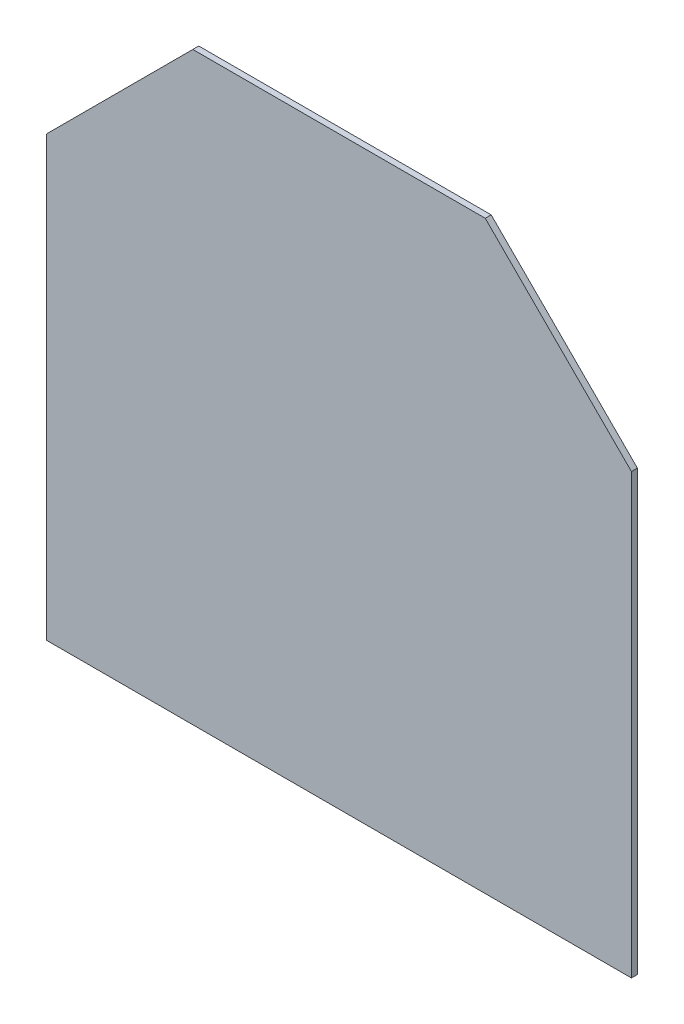
ISO-10303-21;
HEADER;
FILE_DESCRIPTION(('STEP AP214'),'2;1');
FILE_NAME('part.step','',(''),(''),'','','');
FILE_SCHEMA(('AUTOMOTIVE_DESIGN { 1 0 10303 214 1 1 1 1 }'));
ENDSEC;
DATA;
#1=APPLICATION_CONTEXT('core data for automotive mechanical design processes');
#2=APPLICATION_PROTOCOL_DEFINITION('international standard','automotive_design',2000,#1);
#3=PRODUCT_CONTEXT('',#1,'mechanical');
#4=PRODUCT('Part','Part','',(#3));
#5=PRODUCT_RELATED_PRODUCT_CATEGORY('part','',(#4));
#6=PRODUCT_DEFINITION_FORMATION('','',#4);
#7=PRODUCT_DEFINITION_CONTEXT('part definition',#1,'design');
#8=PRODUCT_DEFINITION('design','',#6,#7);
#9=PRODUCT_DEFINITION_SHAPE('','',#8);
#10=(LENGTH_UNIT() NAMED_UNIT(*) SI_UNIT(.MILLI.,.METRE.));
#11=(NAMED_UNIT(*) PLANE_ANGLE_UNIT() SI_UNIT($,.RADIAN.));
#12=(NAMED_UNIT(*) SI_UNIT($,.STERADIAN.) SOLID_ANGLE_UNIT());
#13=UNCERTAINTY_MEASURE_WITH_UNIT(LENGTH_MEASURE(1.E-05),#10,'distance_accuracy_value','');
#14=(GEOMETRIC_REPRESENTATION_CONTEXT(3) GLOBAL_UNCERTAINTY_ASSIGNED_CONTEXT((#13)) GLOBAL_UNIT_ASSIGNED_CONTEXT((#10,
#11,#12)) REPRESENTATION_CONTEXT('',''));
#15=CARTESIAN_POINT('',(0.,0.,0.));
#16=DIRECTION('',(0.,0.,1.));
#17=DIRECTION('',(1.,0.,0.));
#18=AXIS2_PLACEMENT_3D('',#15,#16,#17);
#19=CARTESIAN_POINT('',(4.999408739739,80.,0.45));
#20=DIRECTION('',(0.,-1.,0.));
#21=DIRECTION('',(0.,0.,-1.));
#22=AXIS2_PLACEMENT_3D('',#19,#20,#21);
#23=PLANE('',#22);
#24=DIRECTION('',(1.,0.,0.));
#25=VECTOR('',#24,1.);
#26=CARTESIAN_POINT('',(4.999408739739,80.,1.06));
#27=LINE('',#26,#25);
#28=CARTESIAN_POINT('',(15.0007945402028,80.,1.06));
#29=VERTEX_POINT('',#28);
#30=CARTESIAN_POINT('',(45.0007945402028,80.,1.06));
#31=VERTEX_POINT('',#30);
#32=EDGE_CURVE('E132',#29,#31,#27,.T.);
#33=ORIENTED_EDGE('',*,*,#32,.T.);
#34=DIRECTION('',(0.,0.,1.));
#35=VECTOR('',#34,1.);
#36=CARTESIAN_POINT('',(45.0007945402028,80.,0.45));
#37=LINE('',#36,#35);
#38=CARTESIAN_POINT('',(45.0007945402028,80.,0.45));
#39=VERTEX_POINT('',#38);
#40=EDGE_CURVE('E11',#39,#31,#37,.T.);
#41=ORIENTED_EDGE('',*,*,#40,.F.);
#42=DIRECTION('',(1.,0.,0.));
#43=VECTOR('',#42,1.);
#44=CARTESIAN_POINT('',(4.999408739739,80.,0.45));
#45=LINE('',#44,#43);
#46=CARTESIAN_POINT('',(15.0007945402028,80.,0.45));
#47=VERTEX_POINT('',#46);
#48=EDGE_CURVE('E145',#47,#39,#45,.T.);
#49=ORIENTED_EDGE('',*,*,#48,.F.);
#50=DIRECTION('',(0.,0.,1.));
#51=VECTOR('',#50,1.);
#52=CARTESIAN_POINT('',(15.0007945402028,80.,0.45));
#53=LINE('',#52,#51);
#54=EDGE_CURVE('E126',#47,#29,#53,.T.);
#55=ORIENTED_EDGE('',*,*,#54,.T.);
#56=EDGE_LOOP('',(#33,#41,#49,#55));
#57=FACE_BOUND('',#56,.T.);
#58=ADVANCED_FACE('F43',(#57),#23,.F.);
#59=CARTESIAN_POINT('',(62.5003972701014,62.5003972701014,0.45));
#60=DIRECTION('',(-0.707106781186548,-0.707106781186548,0.));
#61=DIRECTION('',(0.707106781186548,-0.707106781186548,0.));
#62=AXIS2_PLACEMENT_3D('',#59,#60,#61);
#63=PLANE('',#62);
#64=DIRECTION('',(0.707106781186548,-0.707106781186548,0.));
#65=VECTOR('',#64,1.);
#66=CARTESIAN_POINT('',(62.5003972701014,62.5003972701014,1.06));
#67=LINE('',#66,#65);
#68=CARTESIAN_POINT('',(60.0007945402028,65.,1.06));
#69=VERTEX_POINT('',#68);
#70=EDGE_CURVE('E135',#31,#69,#67,.T.);
#71=ORIENTED_EDGE('',*,*,#70,.T.);
#72=DIRECTION('',(0.,0.,1.));
#73=VECTOR('',#72,1.);
#74=CARTESIAN_POINT('',(60.0007945402028,65.,0.45));
#75=LINE('',#74,#73);
#76=CARTESIAN_POINT('',(60.0007945402028,65.,0.45));
#77=VERTEX_POINT('',#76);
#78=EDGE_CURVE('E51',#77,#69,#75,.T.);
#79=ORIENTED_EDGE('',*,*,#78,.F.);
#80=DIRECTION('',(0.707106781186548,-0.707106781186548,0.));
#81=VECTOR('',#80,1.);
#82=CARTESIAN_POINT('',(62.5003972701014,62.5003972701014,0.45));
#83=LINE('',#82,#81);
#84=EDGE_CURVE('E96',#39,#77,#83,.T.);
#85=ORIENTED_EDGE('',*,*,#84,.F.);
#86=ORIENTED_EDGE('',*,*,#40,.T.);
#87=EDGE_LOOP('',(#71,#79,#85,#86));
#88=FACE_BOUND('',#87,.T.);
#89=ADVANCED_FACE('F168',(#88),#63,.F.);
#90=CARTESIAN_POINT('',(60.0007945402028,4.99940873973899,0.45));
#91=DIRECTION('',(-1.,0.,0.));
#92=DIRECTION('',(0.,-1.,0.));
#93=AXIS2_PLACEMENT_3D('',#90,#91,#92);
#94=PLANE('',#93);
#95=DIRECTION('',(0.,-1.,0.));
#96=VECTOR('',#95,1.);
#97=CARTESIAN_POINT('',(60.0007945402028,4.99940873973899,1.06));
#98=LINE('',#97,#96);
#99=CARTESIAN_POINT('',(60.0007945402028,20.,1.06));
#100=VERTEX_POINT('',#99);
#101=EDGE_CURVE('E139',#69,#100,#98,.T.);
#102=ORIENTED_EDGE('',*,*,#101,.T.);
#103=DIRECTION('',(0.,0.,1.));
#104=VECTOR('',#103,1.);
#105=CARTESIAN_POINT('',(60.0007945402028,20.,0.45));
#106=LINE('',#105,#104);
#107=CARTESIAN_POINT('',(60.0007945402028,20.,0.45));
#108=VERTEX_POINT('',#107);
#109=EDGE_CURVE('E118',#108,#100,#106,.T.);
#110=ORIENTED_EDGE('',*,*,#109,.F.);
#111=DIRECTION('',(0.,-1.,0.));
#112=VECTOR('',#111,1.);
#113=CARTESIAN_POINT('',(60.0007945402028,4.99940873973899,0.45));
#114=LINE('',#113,#112);
#115=EDGE_CURVE('E108',#77,#108,#114,.T.);
#116=ORIENTED_EDGE('',*,*,#115,.F.);
#117=ORIENTED_EDGE('',*,*,#78,.T.);
#118=EDGE_LOOP('',(#102,#110,#116,#117));
#119=FACE_BOUND('',#118,.T.);
#120=ADVANCED_FACE('F147',(#119),#94,.F.);
#121=CARTESIAN_POINT('',(4.999408739739,20.,0.45));
#122=DIRECTION('',(0.,1.,0.));
#123=DIRECTION('',(-1.,0.,0.));
#124=AXIS2_PLACEMENT_3D('',#121,#122,#123);
#125=PLANE('',#124);
#126=DIRECTION('',(-1.,0.,0.));
#127=VECTOR('',#126,1.);
#128=CARTESIAN_POINT('',(4.999408739739,20.,1.06));
#129=LINE('',#128,#127);
#130=CARTESIAN_POINT('',(0.000794540202762141,20.,1.06));
#131=VERTEX_POINT('',#130);
#132=EDGE_CURVE('E119',#100,#131,#129,.T.);
#133=ORIENTED_EDGE('',*,*,#132,.T.);
#134=DIRECTION('',(0.,0.,1.));
#135=VECTOR('',#134,1.);
#136=CARTESIAN_POINT('',(0.000794540202762141,20.,0.45));
#137=LINE('',#136,#135);
#138=CARTESIAN_POINT('',(0.000794540202762141,20.,0.45));
#139=VERTEX_POINT('',#138);
#140=EDGE_CURVE('E113',#139,#131,#137,.T.);
#141=ORIENTED_EDGE('',*,*,#140,.F.);
#142=DIRECTION('',(-1.,0.,0.));
#143=VECTOR('',#142,1.);
#144=CARTESIAN_POINT('',(4.999408739739,20.,0.45));
#145=LINE('',#144,#143);
#146=EDGE_CURVE('E103',#108,#139,#145,.T.);
#147=ORIENTED_EDGE('',*,*,#146,.F.);
#148=ORIENTED_EDGE('',*,*,#109,.T.);
#149=EDGE_LOOP('',(#133,#141,#147,#148));
#150=FACE_BOUND('',#149,.T.);
#151=ADVANCED_FACE('F116',(#150),#125,.F.);
#152=CARTESIAN_POINT('',(0.000794540202762005,4.999408739739,0.45));
#153=DIRECTION('',(1.,0.,0.));
#154=DIRECTION('',(0.,1.,0.));
#155=AXIS2_PLACEMENT_3D('',#152,#153,#154);
#156=PLANE('',#155);
#157=DIRECTION('',(0.,1.,0.));
#158=VECTOR('',#157,1.);
#159=CARTESIAN_POINT('',(0.000794540202762005,4.999408739739,1.06));
#160=LINE('',#159,#158);
#161=CARTESIAN_POINT('',(0.000794540202766342,65.,1.06));
#162=VERTEX_POINT('',#161);
#163=EDGE_CURVE('E84',#131,#162,#160,.T.);
#164=ORIENTED_EDGE('',*,*,#163,.T.);
#165=DIRECTION('',(0.,0.,1.));
#166=VECTOR('',#165,1.);
#167=CARTESIAN_POINT('',(0.000794540202766342,65.,0.45));
#168=LINE('',#167,#166);
#169=CARTESIAN_POINT('',(0.000794540202766342,65.,0.45));
#170=VERTEX_POINT('',#169);
#171=EDGE_CURVE('E120',#170,#162,#168,.T.);
#172=ORIENTED_EDGE('',*,*,#171,.F.);
#173=DIRECTION('',(0.,1.,0.));
#174=VECTOR('',#173,1.);
#175=CARTESIAN_POINT('',(0.000794540202762005,4.999408739739,0.45));
#176=LINE('',#175,#174);
#177=EDGE_CURVE('E110',#139,#170,#176,.T.);
#178=ORIENTED_EDGE('',*,*,#177,.F.);
#179=ORIENTED_EDGE('',*,*,#140,.T.);
#180=EDGE_LOOP('',(#164,#172,#178,#179));
#181=FACE_BOUND('',#180,.T.);
#182=ADVANCED_FACE('F124',(#181),#156,.F.);
#183=CARTESIAN_POINT('',(-27.5001939901596,37.4990114696376,0.45));
#184=DIRECTION('',(0.707106781186547,-0.707106781186548,0.));
#185=DIRECTION('',(0.707106781186548,0.707106781186547,0.));
#186=AXIS2_PLACEMENT_3D('',#183,#184,#185);
#187=PLANE('',#186);
#188=DIRECTION('',(0.707106781186548,0.707106781186547,0.));
#189=VECTOR('',#188,1.);
#190=CARTESIAN_POINT('',(-27.5001939901596,37.4990114696376,1.06));
#191=LINE('',#190,#189);
#192=EDGE_CURVE('E86',#162,#29,#191,.T.);
#193=ORIENTED_EDGE('',*,*,#192,.T.);
#194=ORIENTED_EDGE('',*,*,#54,.F.);
#195=DIRECTION('',(0.707106781186548,0.707106781186547,0.));
#196=VECTOR('',#195,1.);
#197=CARTESIAN_POINT('',(-27.5001939901596,37.4990114696376,0.45));
#198=LINE('',#197,#196);
#199=EDGE_CURVE('E56',#170,#47,#198,.T.);
#200=ORIENTED_EDGE('',*,*,#199,.F.);
#201=ORIENTED_EDGE('',*,*,#171,.T.);
#202=EDGE_LOOP('',(#193,#194,#200,#201));
#203=FACE_BOUND('',#202,.T.);
#204=ADVANCED_FACE('F160',(#203),#187,.F.);
#205=CARTESIAN_POINT('',(0.,0.,0.45));
#206=DIRECTION('',(0.,0.,-1.));
#207=DIRECTION('',(-1.,0.,0.));
#208=AXIS2_PLACEMENT_3D('',#205,#206,#207);
#209=PLANE('',#208);
#210=ORIENTED_EDGE('',*,*,#48,.T.);
#211=ORIENTED_EDGE('',*,*,#84,.T.);
#212=ORIENTED_EDGE('',*,*,#115,.T.);
#213=ORIENTED_EDGE('',*,*,#146,.T.);
#214=ORIENTED_EDGE('',*,*,#177,.T.);
#215=ORIENTED_EDGE('',*,*,#199,.T.);
#216=EDGE_LOOP('',(#210,#211,#212,#213,#214,#215));
#217=FACE_BOUND('',#216,.T.);
#218=ADVANCED_FACE('F104',(#217),#209,.T.);
#219=CARTESIAN_POINT('',(0.,0.,1.06));
#220=DIRECTION('',(0.,0.,-1.));
#221=DIRECTION('',(-1.,0.,0.));
#222=AXIS2_PLACEMENT_3D('',#219,#220,#221);
#223=PLANE('',#222);
#224=ORIENTED_EDGE('',*,*,#32,.F.);
#225=ORIENTED_EDGE('',*,*,#192,.F.);
#226=ORIENTED_EDGE('',*,*,#163,.F.);
#227=ORIENTED_EDGE('',*,*,#132,.F.);
#228=ORIENTED_EDGE('',*,*,#101,.F.);
#229=ORIENTED_EDGE('',*,*,#70,.F.);
#230=EDGE_LOOP('',(#224,#225,#226,#227,#228,#229));
#231=FACE_BOUND('',#230,.T.);
#232=ADVANCED_FACE('F153',(#231),#223,.F.);
#233=CLOSED_SHELL('',(#58,#89,#120,#151,#182,#204,#218,#232));
#234=MANIFOLD_SOLID_BREP('B2',#233);
#235=ADVANCED_BREP_SHAPE_REPRESENTATION('',(#18,#234),#14);
#236=SHAPE_DEFINITION_REPRESENTATION(#9,#235);
ENDSEC;
END-ISO-10303-21;
